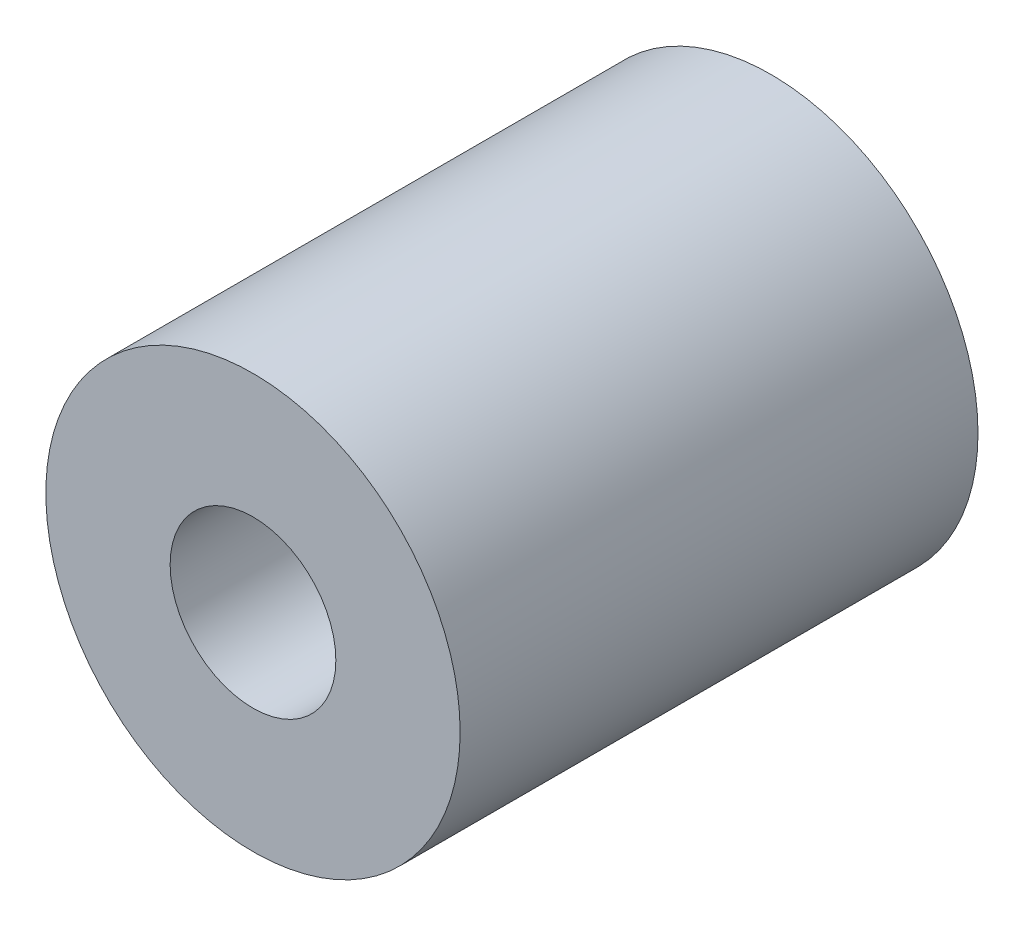
ISO-10303-21;
HEADER;
FILE_DESCRIPTION(('STEP AP214'),'2;1');
FILE_NAME('part.step','',(''),(''),'','','');
FILE_SCHEMA(('AUTOMOTIVE_DESIGN { 1 0 10303 214 1 1 1 1 }'));
ENDSEC;
DATA;
#1=APPLICATION_CONTEXT('core data for automotive mechanical design processes');
#2=APPLICATION_PROTOCOL_DEFINITION('international standard','automotive_design',2000,#1);
#3=PRODUCT_CONTEXT('',#1,'mechanical');
#4=PRODUCT('Part','Part','',(#3));
#5=PRODUCT_RELATED_PRODUCT_CATEGORY('part','',(#4));
#6=PRODUCT_DEFINITION_FORMATION('','',#4);
#7=PRODUCT_DEFINITION_CONTEXT('part definition',#1,'design');
#8=PRODUCT_DEFINITION('design','',#6,#7);
#9=PRODUCT_DEFINITION_SHAPE('','',#8);
#10=(LENGTH_UNIT() NAMED_UNIT(*) SI_UNIT(.MILLI.,.METRE.));
#11=(NAMED_UNIT(*) PLANE_ANGLE_UNIT() SI_UNIT($,.RADIAN.));
#12=(NAMED_UNIT(*) SI_UNIT($,.STERADIAN.) SOLID_ANGLE_UNIT());
#13=UNCERTAINTY_MEASURE_WITH_UNIT(LENGTH_MEASURE(1.E-05),#10,'distance_accuracy_value','');
#14=(GEOMETRIC_REPRESENTATION_CONTEXT(3) GLOBAL_UNCERTAINTY_ASSIGNED_CONTEXT((#13)) GLOBAL_UNIT_ASSIGNED_CONTEXT((#10,
#11,#12)) REPRESENTATION_CONTEXT('',''));
#15=CARTESIAN_POINT('',(0.,0.,0.));
#16=DIRECTION('',(0.,0.,1.));
#17=DIRECTION('',(1.,0.,0.));
#18=AXIS2_PLACEMENT_3D('',#15,#16,#17);
#19=CARTESIAN_POINT('',(0.,0.,25.));
#20=DIRECTION('',(0.,0.,-1.));
#21=DIRECTION('',(-1.,0.,0.));
#22=AXIS2_PLACEMENT_3D('',#19,#20,#21);
#23=CYLINDRICAL_SURFACE('',#22,4.);
#24=CARTESIAN_POINT('',(0.,0.,25.));
#25=DIRECTION('',(0.,0.,1.));
#26=DIRECTION('',(1.,0.,0.));
#27=AXIS2_PLACEMENT_3D('',#24,#25,#26);
#28=CIRCLE('',#27,4.);
#29=CARTESIAN_POINT('',(4.,0.,25.));
#30=VERTEX_POINT('',#29);
#31=EDGE_CURVE('E51',#30,#30,#28,.T.);
#32=ORIENTED_EDGE('',*,*,#31,.T.);
#33=EDGE_LOOP('',(#32));
#34=FACE_BOUND('',#33,.T.);
#35=CARTESIAN_POINT('',(0.,0.,10.));
#36=DIRECTION('',(0.,0.,-1.));
#37=DIRECTION('',(-1.,0.,0.));
#38=AXIS2_PLACEMENT_3D('',#35,#36,#37);
#39=CIRCLE('',#38,4.);
#40=CARTESIAN_POINT('',(-4.,0.,10.));
#41=VERTEX_POINT('',#40);
#42=EDGE_CURVE('E40',#41,#41,#39,.T.);
#43=ORIENTED_EDGE('',*,*,#42,.T.);
#44=EDGE_LOOP('',(#43));
#45=FACE_BOUND('',#44,.T.);
#46=ADVANCED_FACE('F36',(#34,#45),#23,.F.);
#47=CARTESIAN_POINT('',(0.,0.,25.));
#48=DIRECTION('',(0.,0.,1.));
#49=DIRECTION('',(1.,0.,0.));
#50=AXIS2_PLACEMENT_3D('',#47,#48,#49);
#51=PLANE('',#50);
#52=CARTESIAN_POINT('',(0.,0.,25.));
#53=DIRECTION('',(0.,0.,1.));
#54=DIRECTION('',(1.,0.,0.));
#55=AXIS2_PLACEMENT_3D('',#52,#53,#54);
#56=CIRCLE('',#55,10.);
#57=CARTESIAN_POINT('',(10.,0.,25.));
#58=VERTEX_POINT('',#57);
#59=EDGE_CURVE('E10',#58,#58,#56,.T.);
#60=ORIENTED_EDGE('',*,*,#59,.T.);
#61=EDGE_LOOP('',(#60));
#62=FACE_BOUND('',#61,.T.);
#63=ORIENTED_EDGE('',*,*,#31,.F.);
#64=EDGE_LOOP('',(#63));
#65=FACE_BOUND('',#64,.T.);
#66=ADVANCED_FACE('F80',(#62,#65),#51,.T.);
#67=CARTESIAN_POINT('',(0.,0.,0.));
#68=DIRECTION('',(0.,0.,1.));
#69=DIRECTION('',(1.,0.,0.));
#70=AXIS2_PLACEMENT_3D('',#67,#68,#69);
#71=PLANE('',#70);
#72=CARTESIAN_POINT('',(0.,0.,0.));
#73=DIRECTION('',(0.,0.,-1.));
#74=DIRECTION('',(-1.,0.,0.));
#75=AXIS2_PLACEMENT_3D('',#72,#73,#74);
#76=CIRCLE('',#75,5.);
#77=CARTESIAN_POINT('',(-5.,0.,0.));
#78=VERTEX_POINT('',#77);
#79=EDGE_CURVE('E56',#78,#78,#76,.T.);
#80=ORIENTED_EDGE('',*,*,#79,.F.);
#81=EDGE_LOOP('',(#80));
#82=FACE_BOUND('',#81,.T.);
#83=CARTESIAN_POINT('',(0.,0.,0.));
#84=DIRECTION('',(0.,0.,1.));
#85=DIRECTION('',(1.,0.,0.));
#86=AXIS2_PLACEMENT_3D('',#83,#84,#85);
#87=CIRCLE('',#86,10.);
#88=CARTESIAN_POINT('',(10.,0.,0.));
#89=VERTEX_POINT('',#88);
#90=EDGE_CURVE('E45',#89,#89,#87,.T.);
#91=ORIENTED_EDGE('',*,*,#90,.F.);
#92=EDGE_LOOP('',(#91));
#93=FACE_BOUND('',#92,.T.);
#94=ADVANCED_FACE('F88',(#82,#93),#71,.F.);
#95=CARTESIAN_POINT('',(0.,0.,25.));
#96=DIRECTION('',(0.,0.,-1.));
#97=DIRECTION('',(-1.,0.,0.));
#98=AXIS2_PLACEMENT_3D('',#95,#96,#97);
#99=CYLINDRICAL_SURFACE('',#98,10.);
#100=ORIENTED_EDGE('',*,*,#59,.F.);
#101=EDGE_LOOP('',(#100));
#102=FACE_BOUND('',#101,.T.);
#103=ORIENTED_EDGE('',*,*,#90,.T.);
#104=EDGE_LOOP('',(#103));
#105=FACE_BOUND('',#104,.T.);
#106=ADVANCED_FACE('F38',(#102,#105),#99,.T.);
#107=CARTESIAN_POINT('',(0.,0.,10.));
#108=DIRECTION('',(0.,0.,-1.));
#109=DIRECTION('',(-1.,0.,0.));
#110=AXIS2_PLACEMENT_3D('',#107,#108,#109);
#111=CYLINDRICAL_SURFACE('',#110,5.);
#112=CARTESIAN_POINT('',(0.,0.,10.));
#113=DIRECTION('',(0.,0.,-1.));
#114=DIRECTION('',(-1.,0.,0.));
#115=AXIS2_PLACEMENT_3D('',#112,#113,#114);
#116=CIRCLE('',#115,5.);
#117=CARTESIAN_POINT('',(-5.,0.,10.));
#118=VERTEX_POINT('',#117);
#119=EDGE_CURVE('E60',#118,#118,#116,.T.);
#120=ORIENTED_EDGE('',*,*,#119,.F.);
#121=EDGE_LOOP('',(#120));
#122=FACE_BOUND('',#121,.T.);
#123=ORIENTED_EDGE('',*,*,#79,.T.);
#124=EDGE_LOOP('',(#123));
#125=FACE_BOUND('',#124,.T.);
#126=ADVANCED_FACE('F72',(#122,#125),#111,.F.);
#127=CARTESIAN_POINT('',(0.,0.,10.));
#128=DIRECTION('',(0.,0.,-1.));
#129=DIRECTION('',(-1.,0.,0.));
#130=AXIS2_PLACEMENT_3D('',#127,#128,#129);
#131=PLANE('',#130);
#132=ORIENTED_EDGE('',*,*,#42,.F.);
#133=EDGE_LOOP('',(#132));
#134=FACE_BOUND('',#133,.T.);
#135=ORIENTED_EDGE('',*,*,#119,.T.);
#136=EDGE_LOOP('',(#135));
#137=FACE_BOUND('',#136,.T.);
#138=ADVANCED_FACE('F70',(#134,#137),#131,.T.);
#139=CLOSED_SHELL('',(#46,#66,#94,#106,#126,#138));
#140=MANIFOLD_SOLID_BREP('B2',#139);
#141=ADVANCED_BREP_SHAPE_REPRESENTATION('',(#18,#140),#14);
#142=SHAPE_DEFINITION_REPRESENTATION(#9,#141);
ENDSEC;
END-ISO-10303-21;
